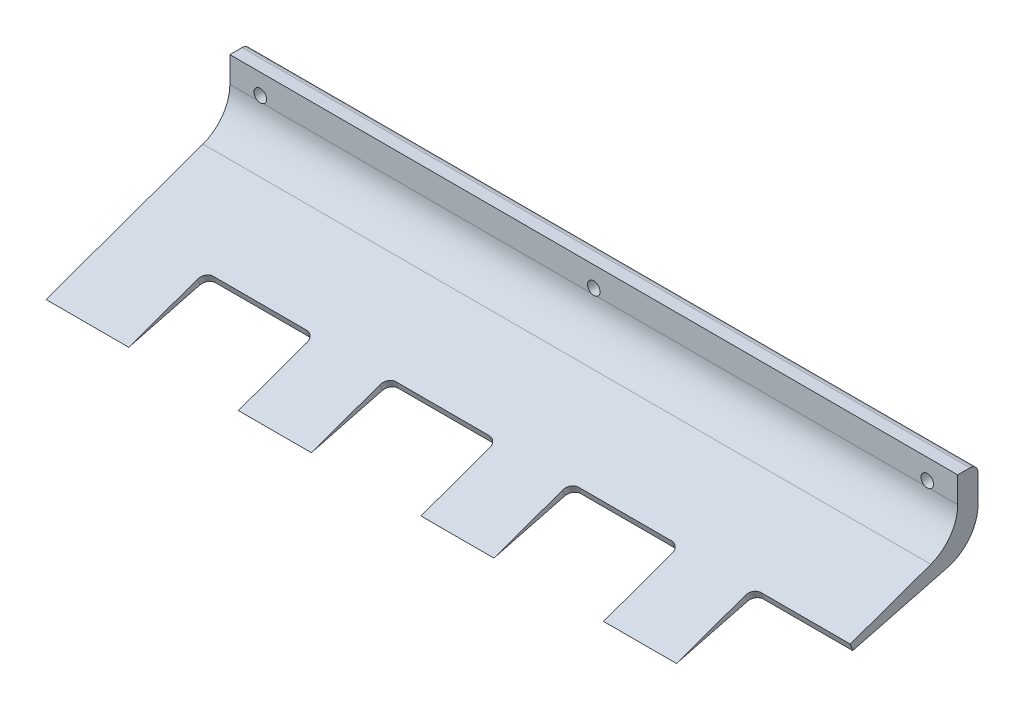
ISO-10303-21;
HEADER;
FILE_DESCRIPTION(('STEP AP214'),'2;1');
FILE_NAME('part.step','',(''),(''),'','','');
FILE_SCHEMA(('AUTOMOTIVE_DESIGN { 1 0 10303 214 1 1 1 1 }'));
ENDSEC;
DATA;
#1=APPLICATION_CONTEXT('core data for automotive mechanical design processes');
#2=APPLICATION_PROTOCOL_DEFINITION('international standard','automotive_design',2000,#1);
#3=PRODUCT_CONTEXT('',#1,'mechanical');
#4=PRODUCT('Part','Part','',(#3));
#5=PRODUCT_RELATED_PRODUCT_CATEGORY('part','',(#4));
#6=PRODUCT_DEFINITION_FORMATION('','',#4);
#7=PRODUCT_DEFINITION_CONTEXT('part definition',#1,'design');
#8=PRODUCT_DEFINITION('design','',#6,#7);
#9=PRODUCT_DEFINITION_SHAPE('','',#8);
#10=(LENGTH_UNIT() NAMED_UNIT(*) SI_UNIT(.MILLI.,.METRE.));
#11=(NAMED_UNIT(*) PLANE_ANGLE_UNIT() SI_UNIT($,.RADIAN.));
#12=(NAMED_UNIT(*) SI_UNIT($,.STERADIAN.) SOLID_ANGLE_UNIT());
#13=UNCERTAINTY_MEASURE_WITH_UNIT(LENGTH_MEASURE(1.E-05),#10,'distance_accuracy_value','');
#14=(GEOMETRIC_REPRESENTATION_CONTEXT(3) GLOBAL_UNCERTAINTY_ASSIGNED_CONTEXT((#13)) GLOBAL_UNIT_ASSIGNED_CONTEXT((#10,
#11,#12)) REPRESENTATION_CONTEXT('',''));
#15=CARTESIAN_POINT('',(0.,0.,0.));
#16=DIRECTION('',(0.,0.,1.));
#17=DIRECTION('',(1.,0.,0.));
#18=AXIS2_PLACEMENT_3D('',#15,#16,#17);
#19=CARTESIAN_POINT('',(179.4,12.0799686122915,4.32153801259702));
#20=DIRECTION('',(0.,-0.941562454937275,-0.336838453049071));
#21=DIRECTION('',(0.,0.336838453049071,-0.941562454937275));
#22=AXIS2_PLACEMENT_3D('',#19,#20,#21);
#23=PLANE('',#22);
#24=DIRECTION('',(-1.,0.,0.));
#25=VECTOR('',#24,1.);
#26=CARTESIAN_POINT('',(179.4,-3.47964772152142,47.8152377981518));
#27=LINE('',#26,#25);
#28=CARTESIAN_POINT('',(155.4,-3.47964772152142,47.8152377981518));
#29=VERTEX_POINT('',#28);
#30=CARTESIAN_POINT('',(137.4,-3.47964772152141,47.8152377981518));
#31=VERTEX_POINT('',#30);
#32=EDGE_CURVE('E253',#29,#31,#27,.T.);
#33=ORIENTED_EDGE('',*,*,#32,.F.);
#34=DIRECTION('',(0.,-0.336838453049071,0.941562454937275));
#35=VECTOR('',#34,1.);
#36=CARTESIAN_POINT('',(155.4,-3.47964772152141,47.8152377981518));
#37=LINE('',#36,#35);
#38=CARTESIAN_POINT('',(155.4,2.58344443336187,30.8671136092809));
#39=VERTEX_POINT('',#38);
#40=EDGE_CURVE('E237',#39,#29,#37,.T.);
#41=ORIENTED_EDGE('',*,*,#40,.F.);
#42=CARTESIAN_POINT('',(157.4,2.58344443336187,30.8671136092809));
#43=DIRECTION('',(0.,-0.941562454937275,-0.336838453049071));
#44=DIRECTION('',(0.,0.336838453049071,-0.941562454937275));
#45=AXIS2_PLACEMENT_3D('',#42,#43,#44);
#46=CIRCLE('',#45,2.);
#47=CARTESIAN_POINT('',(157.4,3.25712133946002,28.9839886994063));
#48=VERTEX_POINT('',#47);
#49=EDGE_CURVE('E906',#39,#48,#46,.T.);
#50=ORIENTED_EDGE('',*,*,#49,.T.);
#51=DIRECTION('',(-1.,0.,0.));
#52=VECTOR('',#51,1.);
#53=CARTESIAN_POINT('',(182.4,3.25712133946002,28.9839886994063));
#54=LINE('',#53,#52);
#55=CARTESIAN_POINT('',(179.4,3.25712133946002,28.9839886994063));
#56=VERTEX_POINT('',#55);
#57=EDGE_CURVE('E247',#56,#48,#54,.T.);
#58=ORIENTED_EDGE('',*,*,#57,.F.);
#59=DIRECTION('',(0.,-0.336838453049071,0.941562454937275));
#60=VECTOR('',#59,1.);
#61=CARTESIAN_POINT('',(179.4,12.0799686122915,4.32153801259702));
#62=LINE('',#61,#60);
#63=CARTESIAN_POINT('',(179.4,10.3591915771234,9.13161546950928));
#64=VERTEX_POINT('',#63);
#65=EDGE_CURVE('E296',#64,#56,#62,.T.);
#66=ORIENTED_EDGE('',*,*,#65,.F.);
#67=DIRECTION('',(-1.,0.,0.));
#68=VECTOR('',#67,1.);
#69=CARTESIAN_POINT('',(0.,10.3591915771234,9.13161546950928));
#70=LINE('',#69,#68);
#71=CARTESIAN_POINT('',(0.,10.3591915771234,9.13161546950928));
#72=VERTEX_POINT('',#71);
#73=EDGE_CURVE('E437',#64,#72,#70,.T.);
#74=ORIENTED_EDGE('',*,*,#73,.T.);
#75=DIRECTION('',(0.,-0.336838453049071,0.941562454937275));
#76=VECTOR('',#75,1.);
#77=CARTESIAN_POINT('',(0.,12.0799686122915,4.32153801259702));
#78=LINE('',#77,#76);
#79=CARTESIAN_POINT('',(0.,-3.47964772152142,47.8152377981518));
#80=VERTEX_POINT('',#79);
#81=EDGE_CURVE('E307',#72,#80,#78,.T.);
#82=ORIENTED_EDGE('',*,*,#81,.T.);
#83=CARTESIAN_POINT('',(20.4000000000002,-3.47964772152142,47.8152377981518));
#84=VERTEX_POINT('',#83);
#85=EDGE_CURVE('E266',#84,#80,#27,.T.);
#86=ORIENTED_EDGE('',*,*,#85,.F.);
#87=DIRECTION('',(0.,-0.336838453049071,0.941562454937275));
#88=VECTOR('',#87,1.);
#89=CARTESIAN_POINT('',(20.4000000000001,-3.47964772152141,47.8152377981518));
#90=LINE('',#89,#88);
#91=CARTESIAN_POINT('',(20.4000000000001,2.58344443336187,30.8671136092809));
#92=VERTEX_POINT('',#91);
#93=EDGE_CURVE('E364',#92,#84,#90,.T.);
#94=ORIENTED_EDGE('',*,*,#93,.F.);
#95=CARTESIAN_POINT('',(22.4000000000001,2.58344443336187,30.8671136092809));
#96=DIRECTION('',(0.,-0.941562454937275,-0.336838453049071));
#97=DIRECTION('',(0.,0.336838453049071,-0.941562454937275));
#98=AXIS2_PLACEMENT_3D('',#95,#96,#97);
#99=CIRCLE('',#98,2.);
#100=CARTESIAN_POINT('',(22.4000000000001,3.25712133946002,28.9839886994063));
#101=VERTEX_POINT('',#100);
#102=EDGE_CURVE('E53',#92,#101,#99,.T.);
#103=ORIENTED_EDGE('',*,*,#102,.T.);
#104=DIRECTION('',(-1.,0.,0.));
#105=VECTOR('',#104,1.);
#106=CARTESIAN_POINT('',(47.4000000000001,3.25712133946002,28.9839886994063));
#107=LINE('',#106,#105);
#108=CARTESIAN_POINT('',(45.4000000000001,3.25712133946002,28.9839886994063));
#109=VERTEX_POINT('',#108);
#110=EDGE_CURVE('E360',#109,#101,#107,.T.);
#111=ORIENTED_EDGE('',*,*,#110,.F.);
#112=CARTESIAN_POINT('',(45.4000000000001,2.58344443336187,30.8671136092809));
#113=DIRECTION('',(0.,-0.941562454937275,-0.336838453049071));
#114=DIRECTION('',(0.,0.336838453049071,-0.941562454937275));
#115=AXIS2_PLACEMENT_3D('',#112,#113,#114);
#116=CIRCLE('',#115,2.);
#117=CARTESIAN_POINT('',(47.4000000000001,2.58344443336188,30.8671136092809));
#118=VERTEX_POINT('',#117);
#119=EDGE_CURVE('E929',#109,#118,#116,.T.);
#120=ORIENTED_EDGE('',*,*,#119,.T.);
#121=DIRECTION('',(0.,0.336838453049071,-0.941562454937275));
#122=VECTOR('',#121,1.);
#123=CARTESIAN_POINT('',(47.4000000000001,-3.47964772152141,47.8152377981518));
#124=LINE('',#123,#122);
#125=CARTESIAN_POINT('',(47.4000000000001,-3.47964772152141,47.8152377981518));
#126=VERTEX_POINT('',#125);
#127=EDGE_CURVE('E356',#126,#118,#124,.T.);
#128=ORIENTED_EDGE('',*,*,#127,.F.);
#129=CARTESIAN_POINT('',(65.4000000000001,-3.47964772152142,47.8152377981518));
#130=VERTEX_POINT('',#129);
#131=EDGE_CURVE('E273',#130,#126,#27,.T.);
#132=ORIENTED_EDGE('',*,*,#131,.F.);
#133=DIRECTION('',(0.,-0.336838453049071,0.941562454937275));
#134=VECTOR('',#133,1.);
#135=CARTESIAN_POINT('',(65.4000000000001,-3.47964772152141,47.8152377981518));
#136=LINE('',#135,#134);
#137=CARTESIAN_POINT('',(65.4000000000001,2.58344443336187,30.8671136092809));
#138=VERTEX_POINT('',#137);
#139=EDGE_CURVE('E348',#138,#130,#136,.T.);
#140=ORIENTED_EDGE('',*,*,#139,.F.);
#141=CARTESIAN_POINT('',(67.4000000000001,2.58344443336187,30.8671136092809));
#142=DIRECTION('',(0.,-0.941562454937275,-0.336838453049071));
#143=DIRECTION('',(0.,0.336838453049071,-0.941562454937275));
#144=AXIS2_PLACEMENT_3D('',#141,#142,#143);
#145=CIRCLE('',#144,2.);
#146=CARTESIAN_POINT('',(67.4000000000001,3.25712133946002,28.9839886994063));
#147=VERTEX_POINT('',#146);
#148=EDGE_CURVE('E923',#138,#147,#145,.T.);
#149=ORIENTED_EDGE('',*,*,#148,.T.);
#150=DIRECTION('',(-1.,0.,0.));
#151=VECTOR('',#150,1.);
#152=CARTESIAN_POINT('',(92.4000000000001,3.25712133946002,28.9839886994063));
#153=LINE('',#152,#151);
#154=CARTESIAN_POINT('',(90.4000000000001,3.25712133946002,28.9839886994063));
#155=VERTEX_POINT('',#154);
#156=EDGE_CURVE('E383',#155,#147,#153,.T.);
#157=ORIENTED_EDGE('',*,*,#156,.F.);
#158=CARTESIAN_POINT('',(90.4000000000001,2.58344443336187,30.8671136092809));
#159=DIRECTION('',(0.,-0.941562454937275,-0.336838453049071));
#160=DIRECTION('',(0.,0.336838453049071,-0.941562454937275));
#161=AXIS2_PLACEMENT_3D('',#158,#159,#160);
#162=CIRCLE('',#161,2.);
#163=CARTESIAN_POINT('',(92.4000000000001,2.58344443336188,30.8671136092809));
#164=VERTEX_POINT('',#163);
#165=EDGE_CURVE('E917',#155,#164,#162,.T.);
#166=ORIENTED_EDGE('',*,*,#165,.T.);
#167=DIRECTION('',(0.,0.336838453049071,-0.941562454937275));
#168=VECTOR('',#167,1.);
#169=CARTESIAN_POINT('',(92.4000000000001,-3.47964772152141,47.8152377981518));
#170=LINE('',#169,#168);
#171=CARTESIAN_POINT('',(92.4000000000001,-3.47964772152141,47.8152377981518));
#172=VERTEX_POINT('',#171);
#173=EDGE_CURVE('E379',#172,#164,#170,.T.);
#174=ORIENTED_EDGE('',*,*,#173,.F.);
#175=CARTESIAN_POINT('',(110.4,-3.47964772152142,47.8152377981518));
#176=VERTEX_POINT('',#175);
#177=EDGE_CURVE('E264',#176,#172,#27,.T.);
#178=ORIENTED_EDGE('',*,*,#177,.F.);
#179=DIRECTION('',(0.,-0.336838453049071,0.941562454937275));
#180=VECTOR('',#179,1.);
#181=CARTESIAN_POINT('',(110.4,-3.47964772152141,47.8152377981518));
#182=LINE('',#181,#180);
#183=CARTESIAN_POINT('',(110.4,2.58344443336187,30.8671136092809));
#184=VERTEX_POINT('',#183);
#185=EDGE_CURVE('E370',#184,#176,#182,.T.);
#186=ORIENTED_EDGE('',*,*,#185,.F.);
#187=CARTESIAN_POINT('',(112.4,2.58344443336187,30.8671136092809));
#188=DIRECTION('',(0.,-0.941562454937275,-0.336838453049071));
#189=DIRECTION('',(0.,0.336838453049071,-0.941562454937275));
#190=AXIS2_PLACEMENT_3D('',#187,#188,#189);
#191=CIRCLE('',#190,2.);
#192=CARTESIAN_POINT('',(112.4,3.25712133946002,28.9839886994063));
#193=VERTEX_POINT('',#192);
#194=EDGE_CURVE('E893',#184,#193,#191,.T.);
#195=ORIENTED_EDGE('',*,*,#194,.T.);
#196=DIRECTION('',(-1.,0.,0.));
#197=VECTOR('',#196,1.);
#198=CARTESIAN_POINT('',(137.4,3.25712133946002,28.9839886994063));
#199=LINE('',#198,#197);
#200=CARTESIAN_POINT('',(135.4,3.25712133946002,28.9839886994063));
#201=VERTEX_POINT('',#200);
#202=EDGE_CURVE('E403',#201,#193,#199,.T.);
#203=ORIENTED_EDGE('',*,*,#202,.F.);
#204=CARTESIAN_POINT('',(135.4,2.58344443336187,30.8671136092809));
#205=DIRECTION('',(0.,-0.941562454937275,-0.336838453049071));
#206=DIRECTION('',(0.,0.336838453049071,-0.941562454937275));
#207=AXIS2_PLACEMENT_3D('',#204,#205,#206);
#208=CIRCLE('',#207,2.);
#209=CARTESIAN_POINT('',(137.4,2.58344443336188,30.8671136092809));
#210=VERTEX_POINT('',#209);
#211=EDGE_CURVE('E911',#201,#210,#208,.T.);
#212=ORIENTED_EDGE('',*,*,#211,.T.);
#213=DIRECTION('',(0.,0.336838453049071,-0.941562454937275));
#214=VECTOR('',#213,1.);
#215=CARTESIAN_POINT('',(137.4,-3.47964772152141,47.8152377981518));
#216=LINE('',#215,#214);
#217=EDGE_CURVE('E261',#31,#210,#216,.T.);
#218=ORIENTED_EDGE('',*,*,#217,.F.);
#219=EDGE_LOOP('',(#33,#41,#50,#58,#66,#74,#82,#86,#94,#103,#111,#120,#128,#132,#140,#149,#157,
#166,#174,#178,#186,#195,#203,#212,#218));
#220=FACE_BOUND('',#219,.T.);
#221=ADVANCED_FACE('F44',(#220),#23,.F.);
#222=CARTESIAN_POINT('',(179.4,8.34007858571382,2.1591294076312));
#223=DIRECTION('',(0.,0.968084626068342,0.250623535946084));
#224=DIRECTION('',(0.,-0.250623535946084,0.968084626068342));
#225=AXIS2_PLACEMENT_3D('',#222,#223,#224);
#226=PLANE('',#225);
#227=DIRECTION('',(1.,0.,0.));
#228=VECTOR('',#227,1.);
#229=CARTESIAN_POINT('',(182.4,1.55329812203007,28.3744559235201));
#230=LINE('',#229,#228);
#231=CARTESIAN_POINT('',(157.4,1.55329812203007,28.3744559235201));
#232=VERTEX_POINT('',#231);
#233=CARTESIAN_POINT('',(179.4,1.55329812203007,28.3744559235201));
#234=VERTEX_POINT('',#233);
#235=EDGE_CURVE('E257',#232,#234,#230,.T.);
#236=ORIENTED_EDGE('',*,*,#235,.F.);
#237=CARTESIAN_POINT('',(157.4,1.05000353767492,30.3185341109832));
#238=DIRECTION('',(0.,0.968084626068342,0.250623535946084));
#239=DIRECTION('',(0.,0.250623535946084,-0.968084626068342));
#240=AXIS2_PLACEMENT_3D('',#237,#238,#239);
#241=ELLIPSE('',#240,2.00816967351151,2.);
#242=CARTESIAN_POINT('',(155.4,1.05000353767492,30.3185341109832));
#243=VERTEX_POINT('',#242);
#244=EDGE_CURVE('E255',#232,#243,#241,.T.);
#245=ORIENTED_EDGE('',*,*,#244,.T.);
#246=DIRECTION('',(0.,0.250623535946084,-0.968084626068342));
#247=VECTOR('',#246,1.);
#248=CARTESIAN_POINT('',(155.4,-3.09686634528519,46.3366665056325));
#249=LINE('',#248,#247);
#250=EDGE_CURVE('E240',#29,#243,#249,.T.);
#251=ORIENTED_EDGE('',*,*,#250,.F.);
#252=ORIENTED_EDGE('',*,*,#32,.T.);
#253=DIRECTION('',(0.,-0.250623535946084,0.968084626068342));
#254=VECTOR('',#253,1.);
#255=CARTESIAN_POINT('',(137.4,-3.09686634528519,46.3366665056325));
#256=LINE('',#255,#254);
#257=CARTESIAN_POINT('',(137.4,1.05000353767492,30.3185341109832));
#258=VERTEX_POINT('',#257);
#259=EDGE_CURVE('E389',#258,#31,#256,.T.);
#260=ORIENTED_EDGE('',*,*,#259,.F.);
#261=CARTESIAN_POINT('',(135.4,1.05000353767492,30.3185341109832));
#262=DIRECTION('',(0.,0.968084626068342,0.250623535946084));
#263=DIRECTION('',(0.,0.250623535946084,-0.968084626068342));
#264=AXIS2_PLACEMENT_3D('',#261,#262,#263);
#265=ELLIPSE('',#264,2.00816967351151,2.);
#266=CARTESIAN_POINT('',(135.4,1.55329812203007,28.3744559235201));
#267=VERTEX_POINT('',#266);
#268=EDGE_CURVE('E914',#258,#267,#265,.T.);
#269=ORIENTED_EDGE('',*,*,#268,.T.);
#270=DIRECTION('',(1.,0.,0.));
#271=VECTOR('',#270,1.);
#272=CARTESIAN_POINT('',(137.4,1.55329812203007,28.3744559235201));
#273=LINE('',#272,#271);
#274=CARTESIAN_POINT('',(112.4,1.55329812203007,28.3744559235201));
#275=VERTEX_POINT('',#274);
#276=EDGE_CURVE('E393',#275,#267,#273,.T.);
#277=ORIENTED_EDGE('',*,*,#276,.F.);
#278=CARTESIAN_POINT('',(112.4,1.05000353767492,30.3185341109832));
#279=DIRECTION('',(0.,0.968084626068342,0.250623535946084));
#280=DIRECTION('',(0.,0.250623535946084,-0.968084626068342));
#281=AXIS2_PLACEMENT_3D('',#278,#279,#280);
#282=ELLIPSE('',#281,2.00816967351151,2.);
#283=CARTESIAN_POINT('',(110.4,1.05000353767492,30.3185341109832));
#284=VERTEX_POINT('',#283);
#285=EDGE_CURVE('E898',#275,#284,#282,.T.);
#286=ORIENTED_EDGE('',*,*,#285,.T.);
#287=DIRECTION('',(0.,0.250623535946084,-0.968084626068342));
#288=VECTOR('',#287,1.);
#289=CARTESIAN_POINT('',(110.4,-3.09686634528519,46.3366665056325));
#290=LINE('',#289,#288);
#291=EDGE_CURVE('E397',#176,#284,#290,.T.);
#292=ORIENTED_EDGE('',*,*,#291,.F.);
#293=ORIENTED_EDGE('',*,*,#177,.T.);
#294=DIRECTION('',(0.,-0.250623535946084,0.968084626068342));
#295=VECTOR('',#294,1.);
#296=CARTESIAN_POINT('',(92.4000000000001,-3.09686634528519,46.3366665056325));
#297=LINE('',#296,#295);
#298=CARTESIAN_POINT('',(92.4000000000001,1.05000353767492,30.3185341109832));
#299=VERTEX_POINT('',#298);
#300=EDGE_CURVE('E367',#299,#172,#297,.T.);
#301=ORIENTED_EDGE('',*,*,#300,.F.);
#302=CARTESIAN_POINT('',(90.4000000000001,1.05000353767492,30.3185341109832));
#303=DIRECTION('',(0.,0.968084626068342,0.250623535946084));
#304=DIRECTION('',(0.,0.250623535946084,-0.968084626068342));
#305=AXIS2_PLACEMENT_3D('',#302,#303,#304);
#306=ELLIPSE('',#305,2.00816967351151,2.);
#307=CARTESIAN_POINT('',(90.4000000000001,1.55329812203007,28.3744559235201));
#308=VERTEX_POINT('',#307);
#309=EDGE_CURVE('E920',#299,#308,#306,.T.);
#310=ORIENTED_EDGE('',*,*,#309,.T.);
#311=DIRECTION('',(1.,0.,0.));
#312=VECTOR('',#311,1.);
#313=CARTESIAN_POINT('',(92.4000000000001,1.55329812203007,28.3744559235201));
#314=LINE('',#313,#312);
#315=CARTESIAN_POINT('',(67.4000000000001,1.55329812203007,28.3744559235201));
#316=VERTEX_POINT('',#315);
#317=EDGE_CURVE('E371',#316,#308,#314,.T.);
#318=ORIENTED_EDGE('',*,*,#317,.F.);
#319=CARTESIAN_POINT('',(67.4000000000001,1.05000353767492,30.3185341109832));
#320=DIRECTION('',(0.,0.968084626068342,0.250623535946084));
#321=DIRECTION('',(0.,0.250623535946084,-0.968084626068342));
#322=AXIS2_PLACEMENT_3D('',#319,#320,#321);
#323=ELLIPSE('',#322,2.00816967351151,2.);
#324=CARTESIAN_POINT('',(65.4000000000001,1.05000353767492,30.3185341109832));
#325=VERTEX_POINT('',#324);
#326=EDGE_CURVE('E926',#316,#325,#323,.T.);
#327=ORIENTED_EDGE('',*,*,#326,.T.);
#328=DIRECTION('',(0.,0.250623535946084,-0.968084626068342));
#329=VECTOR('',#328,1.);
#330=CARTESIAN_POINT('',(65.4000000000001,-3.09686634528519,46.3366665056325));
#331=LINE('',#330,#329);
#332=EDGE_CURVE('E375',#130,#325,#331,.T.);
#333=ORIENTED_EDGE('',*,*,#332,.F.);
#334=ORIENTED_EDGE('',*,*,#131,.T.);
#335=DIRECTION('',(0.,-0.250623535946084,0.968084626068342));
#336=VECTOR('',#335,1.);
#337=CARTESIAN_POINT('',(47.4000000000001,-3.09686634528519,46.3366665056325));
#338=LINE('',#337,#336);
#339=CARTESIAN_POINT('',(47.4000000000001,1.05000353767492,30.3185341109832));
#340=VERTEX_POINT('',#339);
#341=EDGE_CURVE('E345',#340,#126,#338,.T.);
#342=ORIENTED_EDGE('',*,*,#341,.F.);
#343=CARTESIAN_POINT('',(45.4000000000001,1.05000353767492,30.3185341109832));
#344=DIRECTION('',(0.,0.968084626068342,0.250623535946084));
#345=DIRECTION('',(0.,0.250623535946084,-0.968084626068342));
#346=AXIS2_PLACEMENT_3D('',#343,#344,#345);
#347=ELLIPSE('',#346,2.00816967351151,2.);
#348=CARTESIAN_POINT('',(45.4000000000001,1.55329812203007,28.3744559235201));
#349=VERTEX_POINT('',#348);
#350=EDGE_CURVE('E932',#340,#349,#347,.T.);
#351=ORIENTED_EDGE('',*,*,#350,.T.);
#352=DIRECTION('',(1.,0.,0.));
#353=VECTOR('',#352,1.);
#354=CARTESIAN_POINT('',(47.4000000000001,1.55329812203007,28.3744559235201));
#355=LINE('',#354,#353);
#356=CARTESIAN_POINT('',(22.4000000000001,1.55329812203007,28.3744559235201));
#357=VERTEX_POINT('',#356);
#358=EDGE_CURVE('E349',#357,#349,#355,.T.);
#359=ORIENTED_EDGE('',*,*,#358,.F.);
#360=CARTESIAN_POINT('',(22.4000000000001,1.05000353767492,30.3185341109832));
#361=DIRECTION('',(0.,0.968084626068342,0.250623535946084));
#362=DIRECTION('',(0.,0.250623535946084,-0.968084626068342));
#363=AXIS2_PLACEMENT_3D('',#360,#361,#362);
#364=ELLIPSE('',#363,2.00816967351151,2.);
#365=CARTESIAN_POINT('',(20.4000000000001,1.05000353767492,30.3185341109832));
#366=VERTEX_POINT('',#365);
#367=EDGE_CURVE('E11',#357,#366,#364,.T.);
#368=ORIENTED_EDGE('',*,*,#367,.T.);
#369=DIRECTION('',(0.,0.250623535946084,-0.968084626068342));
#370=VECTOR('',#369,1.);
#371=CARTESIAN_POINT('',(20.4000000000001,-3.09686634528519,46.3366665056325));
#372=LINE('',#371,#370);
#373=EDGE_CURVE('E353',#84,#366,#372,.T.);
#374=ORIENTED_EDGE('',*,*,#373,.F.);
#375=ORIENTED_EDGE('',*,*,#85,.T.);
#376=DIRECTION('',(0.,0.250623535946084,-0.968084626068342));
#377=VECTOR('',#376,1.);
#378=CARTESIAN_POINT('',(0.,8.34007858571382,2.1591294076312));
#379=LINE('',#378,#377);
#380=CARTESIAN_POINT('',(0.,7.60623126900352,4.99376464053915));
#381=VERTEX_POINT('',#380);
#382=EDGE_CURVE('E304',#80,#381,#379,.T.);
#383=ORIENTED_EDGE('',*,*,#382,.T.);
#384=DIRECTION('',(-1.,0.,0.));
#385=VECTOR('',#384,1.);
#386=CARTESIAN_POINT('',(179.4,7.60623126900352,4.99376464053915));
#387=LINE('',#386,#385);
#388=CARTESIAN_POINT('',(179.4,7.60623126900352,4.99376464053915));
#389=VERTEX_POINT('',#388);
#390=EDGE_CURVE('E425',#381,#389,#387,.F.);
#391=ORIENTED_EDGE('',*,*,#390,.T.);
#392=DIRECTION('',(0.,0.250623535946084,-0.968084626068342));
#393=VECTOR('',#392,1.);
#394=CARTESIAN_POINT('',(179.4,8.34007858571382,2.1591294076312));
#395=LINE('',#394,#393);
#396=EDGE_CURVE('E317',#234,#389,#395,.T.);
#397=ORIENTED_EDGE('',*,*,#396,.F.);
#398=EDGE_LOOP('',(#236,#245,#251,#252,#260,#269,#277,#286,#292,#293,#301,#310,#318,#327,#333,
#334,#342,#351,#359,#368,#374,#375,#383,#391,#397));
#399=FACE_BOUND('',#398,.T.);
#400=ADVANCED_FACE('F251',(#399),#226,.F.);
#401=CARTESIAN_POINT('',(179.4,0.,-2.50000000000001));
#402=DIRECTION('',(0.,0.,-1.));
#403=DIRECTION('',(0.,1.,0.));
#404=AXIS2_PLACEMENT_3D('',#401,#402,#403);
#405=PLANE('',#404);
#406=CARTESIAN_POINT('',(7.50000000000001,21.1389375146153,-2.5));
#407=DIRECTION('',(0.,0.,-1.));
#408=DIRECTION('',(0.,1.,0.));
#409=AXIS2_PLACEMENT_3D('',#406,#407,#408);
#410=CIRCLE('',#409,1.55);
#411=CARTESIAN_POINT('',(7.50000000000001,22.6889375146153,-2.5));
#412=VERTEX_POINT('',#411);
#413=EDGE_CURVE('E309',#412,#412,#410,.T.);
#414=ORIENTED_EDGE('',*,*,#413,.F.);
#415=EDGE_LOOP('',(#414));
#416=FACE_BOUND('',#415,.T.);
#417=CARTESIAN_POINT('',(171.9,21.1389375146153,-2.5));
#418=DIRECTION('',(0.,0.,-1.));
#419=DIRECTION('',(0.,1.,0.));
#420=AXIS2_PLACEMENT_3D('',#417,#418,#419);
#421=CIRCLE('',#420,1.54999999999999);
#422=CARTESIAN_POINT('',(171.9,22.6889375146153,-2.5));
#423=VERTEX_POINT('',#422);
#424=EDGE_CURVE('E330',#423,#423,#421,.T.);
#425=ORIENTED_EDGE('',*,*,#424,.F.);
#426=EDGE_LOOP('',(#425));
#427=FACE_BOUND('',#426,.T.);
#428=CARTESIAN_POINT('',(89.7,21.1389375146153,-2.5));
#429=DIRECTION('',(0.,0.,-1.));
#430=DIRECTION('',(0.,1.,0.));
#431=AXIS2_PLACEMENT_3D('',#428,#429,#430);
#432=CIRCLE('',#431,1.54999999999999);
#433=CARTESIAN_POINT('',(89.7,22.6889375146153,-2.5));
#434=VERTEX_POINT('',#433);
#435=EDGE_CURVE('E338',#434,#434,#432,.T.);
#436=ORIENTED_EDGE('',*,*,#435,.F.);
#437=EDGE_LOOP('',(#436));
#438=FACE_BOUND('',#437,.T.);
#439=DIRECTION('',(0.,-1.,0.));
#440=VECTOR('',#439,1.);
#441=CARTESIAN_POINT('',(0.,0.,-2.50000000000001));
#442=LINE('',#441,#440);
#443=CARTESIAN_POINT('',(0.,24.1389375146153,-2.5));
#444=VERTEX_POINT('',#443);
#445=CARTESIAN_POINT('',(0.,17.2870775296869,-2.5));
#446=VERTEX_POINT('',#445);
#447=EDGE_CURVE('E301',#444,#446,#442,.T.);
#448=ORIENTED_EDGE('',*,*,#447,.F.);
#449=DIRECTION('',(-1.,0.,0.));
#450=VECTOR('',#449,1.);
#451=CARTESIAN_POINT('',(179.4,24.1389375146153,-2.5));
#452=LINE('',#451,#450);
#453=CARTESIAN_POINT('',(179.4,24.1389375146153,-2.5));
#454=VERTEX_POINT('',#453);
#455=EDGE_CURVE('E463',#444,#454,#452,.F.);
#456=ORIENTED_EDGE('',*,*,#455,.T.);
#457=DIRECTION('',(0.,-1.,0.));
#458=VECTOR('',#457,1.);
#459=CARTESIAN_POINT('',(179.4,0.,-2.50000000000001));
#460=LINE('',#459,#458);
#461=CARTESIAN_POINT('',(179.4,17.2870775296869,-2.5));
#462=VERTEX_POINT('',#461);
#463=EDGE_CURVE('E314',#454,#462,#460,.T.);
#464=ORIENTED_EDGE('',*,*,#463,.T.);
#465=DIRECTION('',(-1.,0.,0.));
#466=VECTOR('',#465,1.);
#467=CARTESIAN_POINT('',(0.,17.2870775296869,-2.5));
#468=LINE('',#467,#466);
#469=EDGE_CURVE('E263',#462,#446,#468,.T.);
#470=ORIENTED_EDGE('',*,*,#469,.T.);
#471=EDGE_LOOP('',(#448,#456,#464,#470));
#472=FACE_BOUND('',#471,.T.);
#473=ADVANCED_FACE('F511',(#416,#427,#438,#472),#405,.T.);
#474=CARTESIAN_POINT('',(179.4,26.1389375146153,0.));
#475=DIRECTION('',(0.,1.,0.));
#476=DIRECTION('',(0.,0.,1.));
#477=AXIS2_PLACEMENT_3D('',#474,#475,#476);
#478=PLANE('',#477);
#479=DIRECTION('',(0.,0.,-1.));
#480=VECTOR('',#479,1.);
#481=CARTESIAN_POINT('',(179.4,26.1389375146153,0.));
#482=LINE('',#481,#480);
#483=CARTESIAN_POINT('',(179.4,26.1389375146153,2.5));
#484=VERTEX_POINT('',#483);
#485=CARTESIAN_POINT('',(179.4,26.1389375146153,-0.5));
#486=VERTEX_POINT('',#485);
#487=EDGE_CURVE('E290',#484,#486,#482,.T.);
#488=ORIENTED_EDGE('',*,*,#487,.T.);
#489=DIRECTION('',(-1.,0.,0.));
#490=VECTOR('',#489,1.);
#491=CARTESIAN_POINT('',(179.4,26.1389375146153,-0.5));
#492=LINE('',#491,#490);
#493=CARTESIAN_POINT('',(0.,26.1389375146153,-0.5));
#494=VERTEX_POINT('',#493);
#495=EDGE_CURVE('E456',#486,#494,#492,.T.);
#496=ORIENTED_EDGE('',*,*,#495,.T.);
#497=DIRECTION('',(0.,0.,-1.));
#498=VECTOR('',#497,1.);
#499=CARTESIAN_POINT('',(0.,26.1389375146153,0.));
#500=LINE('',#499,#498);
#501=CARTESIAN_POINT('',(0.,26.1389375146153,2.5));
#502=VERTEX_POINT('',#501);
#503=EDGE_CURVE('E297',#502,#494,#500,.T.);
#504=ORIENTED_EDGE('',*,*,#503,.F.);
#505=DIRECTION('',(-1.,0.,0.));
#506=VECTOR('',#505,1.);
#507=CARTESIAN_POINT('',(179.4,26.1389375146153,2.5));
#508=LINE('',#507,#506);
#509=EDGE_CURVE('E276',#484,#502,#508,.T.);
#510=ORIENTED_EDGE('',*,*,#509,.F.);
#511=EDGE_LOOP('',(#488,#496,#504,#510));
#512=FACE_BOUND('',#511,.T.);
#513=ADVANCED_FACE('F508',(#512),#478,.T.);
#514=CARTESIAN_POINT('',(179.4,0.,2.5));
#515=DIRECTION('',(0.,0.,-1.));
#516=DIRECTION('',(0.,1.,0.));
#517=AXIS2_PLACEMENT_3D('',#514,#515,#516);
#518=PLANE('',#517);
#519=DIRECTION('',(-1.,0.,0.));
#520=VECTOR('',#519,1.);
#521=CARTESIAN_POINT('',(179.4,19.7748161264962,2.5));
#522=LINE('',#521,#520);
#523=CARTESIAN_POINT('',(0.,19.7748161264962,2.5));
#524=VERTEX_POINT('',#523);
#525=CARTESIAN_POINT('',(6.7640157348992,19.7748161264962,2.5));
#526=VERTEX_POINT('',#525);
#527=EDGE_CURVE('E445',#524,#526,#522,.F.);
#528=ORIENTED_EDGE('',*,*,#527,.T.);
#529=CARTESIAN_POINT('',(7.50000000000001,21.1389375146153,2.5));
#530=DIRECTION('',(0.,0.,-1.));
#531=DIRECTION('',(0.,1.,0.));
#532=AXIS2_PLACEMENT_3D('',#529,#530,#531);
#533=CIRCLE('',#532,1.55);
#534=CARTESIAN_POINT('',(8.23598426510081,19.7748161264962,2.5));
#535=VERTEX_POINT('',#534);
#536=EDGE_CURVE('E326',#526,#535,#533,.T.);
#537=ORIENTED_EDGE('',*,*,#536,.T.);
#538=CARTESIAN_POINT('',(88.9640157348992,19.7748161264962,2.5));
#539=VERTEX_POINT('',#538);
#540=EDGE_CURVE('E450',#535,#539,#522,.F.);
#541=ORIENTED_EDGE('',*,*,#540,.T.);
#542=CARTESIAN_POINT('',(89.7,21.1389375146153,2.5));
#543=DIRECTION('',(0.,0.,-1.));
#544=DIRECTION('',(0.,1.,0.));
#545=AXIS2_PLACEMENT_3D('',#542,#543,#544);
#546=CIRCLE('',#545,1.54999999999999);
#547=CARTESIAN_POINT('',(90.4359842651008,19.7748161264962,2.5));
#548=VERTEX_POINT('',#547);
#549=EDGE_CURVE('E246',#539,#548,#546,.T.);
#550=ORIENTED_EDGE('',*,*,#549,.T.);
#551=CARTESIAN_POINT('',(171.164015734899,19.7748161264962,2.5));
#552=VERTEX_POINT('',#551);
#553=EDGE_CURVE('E535',#548,#552,#522,.F.);
#554=ORIENTED_EDGE('',*,*,#553,.T.);
#555=CARTESIAN_POINT('',(171.9,21.1389375146153,2.5));
#556=DIRECTION('',(0.,0.,-1.));
#557=DIRECTION('',(0.,1.,0.));
#558=AXIS2_PLACEMENT_3D('',#555,#556,#557);
#559=CIRCLE('',#558,1.54999999999999);
#560=CARTESIAN_POINT('',(172.635984265101,19.7748161264962,2.5));
#561=VERTEX_POINT('',#560);
#562=EDGE_CURVE('E334',#552,#561,#559,.T.);
#563=ORIENTED_EDGE('',*,*,#562,.T.);
#564=CARTESIAN_POINT('',(179.4,19.7748161264962,2.5));
#565=VERTEX_POINT('',#564);
#566=EDGE_CURVE('E441',#561,#565,#522,.F.);
#567=ORIENTED_EDGE('',*,*,#566,.T.);
#568=DIRECTION('',(0.,-1.,0.));
#569=VECTOR('',#568,1.);
#570=CARTESIAN_POINT('',(179.4,0.,2.5));
#571=LINE('',#570,#569);
#572=EDGE_CURVE('E283',#484,#565,#571,.T.);
#573=ORIENTED_EDGE('',*,*,#572,.F.);
#574=ORIENTED_EDGE('',*,*,#509,.T.);
#575=DIRECTION('',(0.,-1.,0.));
#576=VECTOR('',#575,1.);
#577=CARTESIAN_POINT('',(0.,0.,2.5));
#578=LINE('',#577,#576);
#579=EDGE_CURVE('E293',#502,#524,#578,.T.);
#580=ORIENTED_EDGE('',*,*,#579,.T.);
#581=EDGE_LOOP('',(#528,#537,#541,#550,#554,#563,#567,#573,#574,#580));
#582=FACE_BOUND('',#581,.T.);
#583=ADVANCED_FACE('F502',(#582),#518,.F.);
#584=CARTESIAN_POINT('',(179.4,0.,0.));
#585=DIRECTION('',(1.,0.,0.));
#586=DIRECTION('',(0.,0.,-1.));
#587=AXIS2_PLACEMENT_3D('',#584,#585,#586);
#588=PLANE('',#587);
#589=DIRECTION('',(0.,-0.941562454937275,-0.336838453049071));
#590=VECTOR('',#589,1.);
#591=CARTESIAN_POINT('',(179.4,-12.7017834609277,23.2747839863976));
#592=LINE('',#591,#590);
#593=EDGE_CURVE('E392',#56,#234,#592,.T.);
#594=ORIENTED_EDGE('',*,*,#593,.T.);
#595=ORIENTED_EDGE('',*,*,#396,.T.);
#596=CARTESIAN_POINT('',(179.4,17.2870775296869,7.5));
#597=DIRECTION('',(1.,0.,0.));
#598=DIRECTION('',(0.,0.,-1.));
#599=AXIS2_PLACEMENT_3D('',#596,#597,#598);
#600=CIRCLE('',#599,10.);
#601=EDGE_CURVE('E431',#389,#462,#600,.T.);
#602=ORIENTED_EDGE('',*,*,#601,.T.);
#603=ORIENTED_EDGE('',*,*,#463,.F.);
#604=CARTESIAN_POINT('',(179.4,24.1389375146153,-0.5));
#605=DIRECTION('',(1.,0.,0.));
#606=DIRECTION('',(0.,0.,-1.));
#607=AXIS2_PLACEMENT_3D('',#604,#605,#606);
#608=CIRCLE('',#607,2.);
#609=EDGE_CURVE('E466',#454,#486,#608,.T.);
#610=ORIENTED_EDGE('',*,*,#609,.T.);
#611=ORIENTED_EDGE('',*,*,#487,.F.);
#612=ORIENTED_EDGE('',*,*,#572,.T.);
#613=CARTESIAN_POINT('',(179.4,19.7748161264962,12.5));
#614=DIRECTION('',(1.,0.,0.));
#615=DIRECTION('',(0.,0.,-1.));
#616=AXIS2_PLACEMENT_3D('',#613,#614,#615);
#617=CIRCLE('',#616,10.);
#618=EDGE_CURVE('E453',#565,#64,#617,.F.);
#619=ORIENTED_EDGE('',*,*,#618,.T.);
#620=ORIENTED_EDGE('',*,*,#65,.T.);
#621=EDGE_LOOP('',(#594,#595,#602,#603,#610,#611,#612,#619,#620));
#622=FACE_BOUND('',#621,.T.);
#623=ADVANCED_FACE('F418',(#622),#588,.T.);
#624=CARTESIAN_POINT('',(0.,0.,0.));
#625=DIRECTION('',(1.,0.,0.));
#626=DIRECTION('',(0.,0.,-1.));
#627=AXIS2_PLACEMENT_3D('',#624,#625,#626);
#628=PLANE('',#627);
#629=ORIENTED_EDGE('',*,*,#503,.T.);
#630=CARTESIAN_POINT('',(0.,24.1389375146153,-0.5));
#631=DIRECTION('',(1.,0.,0.));
#632=DIRECTION('',(0.,0.,-1.));
#633=AXIS2_PLACEMENT_3D('',#630,#631,#632);
#634=CIRCLE('',#633,2.);
#635=EDGE_CURVE('E460',#494,#444,#634,.F.);
#636=ORIENTED_EDGE('',*,*,#635,.T.);
#637=ORIENTED_EDGE('',*,*,#447,.T.);
#638=CARTESIAN_POINT('',(0.,17.2870775296869,7.5));
#639=DIRECTION('',(1.,0.,0.));
#640=DIRECTION('',(0.,0.,-1.));
#641=AXIS2_PLACEMENT_3D('',#638,#639,#640);
#642=CIRCLE('',#641,10.);
#643=EDGE_CURVE('E270',#446,#381,#642,.F.);
#644=ORIENTED_EDGE('',*,*,#643,.T.);
#645=ORIENTED_EDGE('',*,*,#382,.F.);
#646=ORIENTED_EDGE('',*,*,#81,.F.);
#647=CARTESIAN_POINT('',(0.,19.7748161264962,12.5));
#648=DIRECTION('',(1.,0.,0.));
#649=DIRECTION('',(0.,0.,-1.));
#650=AXIS2_PLACEMENT_3D('',#647,#648,#649);
#651=CIRCLE('',#650,10.);
#652=EDGE_CURVE('E449',#72,#524,#651,.T.);
#653=ORIENTED_EDGE('',*,*,#652,.T.);
#654=ORIENTED_EDGE('',*,*,#579,.F.);
#655=EDGE_LOOP('',(#629,#636,#637,#644,#645,#646,#653,#654));
#656=FACE_BOUND('',#655,.T.);
#657=ADVANCED_FACE('F501',(#656),#628,.F.);
#658=CARTESIAN_POINT('',(179.4,17.2870775296869,7.5));
#659=DIRECTION('',(1.,0.,0.));
#660=DIRECTION('',(0.,0.,-1.));
#661=AXIS2_PLACEMENT_3D('',#658,#659,#660);
#662=CYLINDRICAL_SURFACE('',#661,10.);
#663=ORIENTED_EDGE('',*,*,#601,.F.);
#664=ORIENTED_EDGE('',*,*,#390,.F.);
#665=ORIENTED_EDGE('',*,*,#643,.F.);
#666=ORIENTED_EDGE('',*,*,#469,.F.);
#667=EDGE_LOOP('',(#663,#664,#665,#666));
#668=FACE_BOUND('',#667,.T.);
#669=ADVANCED_FACE('F434',(#668),#662,.T.);
#670=CARTESIAN_POINT('',(179.4,19.7748161264962,12.5));
#671=DIRECTION('',(1.,0.,0.));
#672=DIRECTION('',(0.,0.,-1.));
#673=AXIS2_PLACEMENT_3D('',#670,#671,#672);
#674=CYLINDRICAL_SURFACE('',#673,10.);
#675=ORIENTED_EDGE('',*,*,#540,.F.);
#676=CARTESIAN_POINT('',(8.23598426510081,19.7748161264962,2.5));
#677=CARTESIAN_POINT('',(8.1975944130916,19.7541039397819,2.50000092723772));
#678=CARTESIAN_POINT('',(8.15834836664296,19.7350228397481,2.50006418878408));
#679=CARTESIAN_POINT('',(8.07839080628798,19.7002343435589,2.50026285522251));
#680=CARTESIAN_POINT('',(8.03767935920194,19.6845267938013,2.50039825682895));
#681=CARTESIAN_POINT('',(7.91389937919457,19.6426925034202,2.50083324435189));
#682=CARTESIAN_POINT('',(7.82900879265822,19.6217591804844,2.5011620939456));
#683=CARTESIAN_POINT('',(7.65689309963735,19.5944334074962,2.50161764945434));
#684=CARTESIAN_POINT('',(7.5696662181303,19.5880523500812,2.50174419696852));
#685=CARTESIAN_POINT('',(7.3953852997034,19.5900196846689,2.50170752579489));
#686=CARTESIAN_POINT('',(7.30833123762007,19.5983657463782,2.50154435294992));
#687=CARTESIAN_POINT('',(7.14259500154387,19.628517218757,2.50105994444034));
#688=CARTESIAN_POINT('',(7.06374273195956,19.6493832316941,2.50075003339153));
#689=CARTESIAN_POINT('',(6.94866865578102,19.6897328060793,2.50035316044625));
#690=CARTESIAN_POINT('',(6.91081432901951,19.7047074336322,2.5002321289415));
#691=CARTESIAN_POINT('',(6.8363960697378,19.7375868411775,2.50005590913885));
#692=CARTESIAN_POINT('',(6.79983225446754,19.7554918865852,2.50000072680885));
#693=CARTESIAN_POINT('',(6.76401573489921,19.7748161264962,2.5));
#694=B_SPLINE_CURVE_WITH_KNOTS('',3,(#676,#677,#678,#679,#680,#681,#682,#683,#684,#685,#686,
#687,#688,#689,#690,#691,#692,#693),.UNSPECIFIED.,.F.,.F.,(4,2,2,2,2,2,2,2,4),(0.,
0.130781929020287,0.261557902096593,0.522516479427349,0.78367928525554,1.04480077061735,
1.28842432427892,1.41044064626191,1.53246802569886),.UNSPECIFIED.);
#695=EDGE_CURVE('E532',#535,#526,#694,.T.);
#696=ORIENTED_EDGE('',*,*,#695,.T.);
#697=ORIENTED_EDGE('',*,*,#527,.F.);
#698=ORIENTED_EDGE('',*,*,#652,.F.);
#699=ORIENTED_EDGE('',*,*,#73,.F.);
#700=ORIENTED_EDGE('',*,*,#618,.F.);
#701=ORIENTED_EDGE('',*,*,#566,.F.);
#702=CARTESIAN_POINT('',(172.635984265101,19.7748161264962,2.5));
#703=CARTESIAN_POINT('',(172.597594413092,19.7541039397819,2.50000092723771));
#704=CARTESIAN_POINT('',(172.558348366643,19.7350228397481,2.50006418878408));
#705=CARTESIAN_POINT('',(172.478390806288,19.7002343435589,2.50026285522251));
#706=CARTESIAN_POINT('',(172.437679359202,19.6845267938013,2.50039825682895));
#707=CARTESIAN_POINT('',(172.313899379195,19.6426925034202,2.50083324435189));
#708=CARTESIAN_POINT('',(172.229008792658,19.6217591804844,2.5011620939456));
#709=CARTESIAN_POINT('',(172.056893099637,19.5944334074963,2.50161764945434));
#710=CARTESIAN_POINT('',(171.96966621813,19.5880523500812,2.50174419696852));
#711=CARTESIAN_POINT('',(171.795385299703,19.5900196846689,2.50170752579489));
#712=CARTESIAN_POINT('',(171.70833123762,19.5983657463782,2.50154435294992));
#713=CARTESIAN_POINT('',(171.542595001544,19.628517218757,2.50105994444034));
#714=CARTESIAN_POINT('',(171.46374273196,19.6493832316941,2.50075003339153));
#715=CARTESIAN_POINT('',(171.348668655781,19.6897328060793,2.50035316044625));
#716=CARTESIAN_POINT('',(171.31081432902,19.7047074336323,2.5002321289415));
#717=CARTESIAN_POINT('',(171.236396069738,19.7375868411775,2.50005590913885));
#718=CARTESIAN_POINT('',(171.199832254468,19.7554918865852,2.50000072680886));
#719=CARTESIAN_POINT('',(171.164015734899,19.7748161264962,2.5));
#720=B_SPLINE_CURVE_WITH_KNOTS('',3,(#702,#703,#704,#705,#706,#707,#708,#709,#710,#711,#712,
#713,#714,#715,#716,#717,#718,#719),.UNSPECIFIED.,.F.,.F.,(4,2,2,2,2,2,2,2,4),(0.,
0.130781929020309,0.26155790209658,0.522516479427319,0.783679285255518,1.0448007706173,
1.28842432427883,1.41044064626179,1.53246802569873),.UNSPECIFIED.);
#721=EDGE_CURVE('E479',#561,#552,#720,.T.);
#722=ORIENTED_EDGE('',*,*,#721,.T.);
#723=ORIENTED_EDGE('',*,*,#553,.F.);
#724=CARTESIAN_POINT('',(90.4359842651008,19.7748161264962,2.5));
#725=CARTESIAN_POINT('',(90.3975944130916,19.7541039397819,2.50000092723772));
#726=CARTESIAN_POINT('',(90.3583483666429,19.7350228397481,2.50006418878408));
#727=CARTESIAN_POINT('',(90.278390806288,19.7002343435589,2.50026285522251));
#728=CARTESIAN_POINT('',(90.2376793592019,19.6845267938013,2.50039825682895));
#729=CARTESIAN_POINT('',(90.1138993791945,19.6426925034202,2.50083324435189));
#730=CARTESIAN_POINT('',(90.0290087926582,19.6217591804844,2.5011620939456));
#731=CARTESIAN_POINT('',(89.8568930996373,19.5944334074963,2.50161764945434));
#732=CARTESIAN_POINT('',(89.7696662181303,19.5880523500812,2.50174419696852));
#733=CARTESIAN_POINT('',(89.5953852997034,19.5900196846689,2.50170752579489));
#734=CARTESIAN_POINT('',(89.5083312376201,19.5983657463782,2.50154435294992));
#735=CARTESIAN_POINT('',(89.3425950015439,19.628517218757,2.50105994444034));
#736=CARTESIAN_POINT('',(89.2637427319596,19.6493832316941,2.50075003339153));
#737=CARTESIAN_POINT('',(89.148668655781,19.6897328060793,2.50035316044625));
#738=CARTESIAN_POINT('',(89.1108143290195,19.7047074336322,2.5002321289415));
#739=CARTESIAN_POINT('',(89.0363960697378,19.7375868411775,2.50005590913885));
#740=CARTESIAN_POINT('',(88.9998322544675,19.7554918865852,2.50000072680886));
#741=CARTESIAN_POINT('',(88.9640157348992,19.7748161264962,2.5));
#742=B_SPLINE_CURVE_WITH_KNOTS('',3,(#724,#725,#726,#727,#728,#729,#730,#731,#732,#733,#734,
#735,#736,#737,#738,#739,#740,#741),.UNSPECIFIED.,.F.,.F.,(4,2,2,2,2,2,2,2,4),(0.,
0.130781929020281,0.261557902096583,0.522516479427338,0.78367928525551,1.04480077061732,
1.28842432427889,1.4104406462619,1.53246802569884),.UNSPECIFIED.);
#743=EDGE_CURVE('E469',#548,#539,#742,.T.);
#744=ORIENTED_EDGE('',*,*,#743,.T.);
#745=EDGE_LOOP('',(#675,#696,#697,#698,#699,#700,#701,#722,#723,#744));
#746=FACE_BOUND('',#745,.T.);
#747=ADVANCED_FACE('F486',(#746),#674,.F.);
#748=CARTESIAN_POINT('',(179.4,24.1389375146153,-0.5));
#749=DIRECTION('',(-1.,0.,0.));
#750=DIRECTION('',(0.,0.,1.));
#751=AXIS2_PLACEMENT_3D('',#748,#749,#750);
#752=CYLINDRICAL_SURFACE('',#751,2.);
#753=ORIENTED_EDGE('',*,*,#609,.F.);
#754=ORIENTED_EDGE('',*,*,#455,.F.);
#755=ORIENTED_EDGE('',*,*,#635,.F.);
#756=ORIENTED_EDGE('',*,*,#495,.F.);
#757=EDGE_LOOP('',(#753,#754,#755,#756));
#758=FACE_BOUND('',#757,.T.);
#759=ADVANCED_FACE('F495',(#758),#752,.T.);
#760=CARTESIAN_POINT('',(89.7,21.1389375146153,-7.50000000000001));
#761=DIRECTION('',(0.,0.,1.));
#762=DIRECTION('',(1.,0.,0.));
#763=AXIS2_PLACEMENT_3D('',#760,#761,#762);
#764=CYLINDRICAL_SURFACE('',#763,1.54999999999999);
#765=ORIENTED_EDGE('',*,*,#435,.T.);
#766=EDGE_LOOP('',(#765));
#767=FACE_BOUND('',#766,.T.);
#768=ORIENTED_EDGE('',*,*,#743,.F.);
#769=ORIENTED_EDGE('',*,*,#549,.F.);
#770=EDGE_LOOP('',(#768,#769));
#771=FACE_BOUND('',#770,.T.);
#772=ADVANCED_FACE('F490',(#767,#771),#764,.F.);
#773=CARTESIAN_POINT('',(171.9,21.1389375146153,-7.50000000000001));
#774=DIRECTION('',(0.,0.,1.));
#775=DIRECTION('',(1.,0.,0.));
#776=AXIS2_PLACEMENT_3D('',#773,#774,#775);
#777=CYLINDRICAL_SURFACE('',#776,1.54999999999999);
#778=ORIENTED_EDGE('',*,*,#424,.T.);
#779=EDGE_LOOP('',(#778));
#780=FACE_BOUND('',#779,.T.);
#781=ORIENTED_EDGE('',*,*,#721,.F.);
#782=ORIENTED_EDGE('',*,*,#562,.F.);
#783=EDGE_LOOP('',(#781,#782));
#784=FACE_BOUND('',#783,.T.);
#785=ADVANCED_FACE('F494',(#780,#784),#777,.F.);
#786=CARTESIAN_POINT('',(7.50000000000001,21.1389375146153,-7.50000000000001));
#787=DIRECTION('',(0.,0.,1.));
#788=DIRECTION('',(1.,0.,0.));
#789=AXIS2_PLACEMENT_3D('',#786,#787,#788);
#790=CYLINDRICAL_SURFACE('',#789,1.55);
#791=ORIENTED_EDGE('',*,*,#413,.T.);
#792=EDGE_LOOP('',(#791));
#793=FACE_BOUND('',#792,.T.);
#794=ORIENTED_EDGE('',*,*,#695,.F.);
#795=ORIENTED_EDGE('',*,*,#536,.F.);
#796=EDGE_LOOP('',(#794,#795));
#797=FACE_BOUND('',#796,.T.);
#798=ADVANCED_FACE('F553',(#793,#797),#790,.F.);
#799=CARTESIAN_POINT('',(155.4,-19.4385525219091,42.1060330851431));
#800=DIRECTION('',(-1.,0.,0.));
#801=DIRECTION('',(0.,0.,1.));
#802=AXIS2_PLACEMENT_3D('',#799,#800,#801);
#803=PLANE('',#802);
#804=ORIENTED_EDGE('',*,*,#250,.T.);
#805=DIRECTION('',(0.,0.941562454937275,0.336838453049071));
#806=VECTOR('',#805,1.);
#807=CARTESIAN_POINT('',(155.4,2.58344443336187,30.8671136092809));
#808=LINE('',#807,#806);
#809=EDGE_CURVE('E242',#243,#39,#808,.T.);
#810=ORIENTED_EDGE('',*,*,#809,.T.);
#811=ORIENTED_EDGE('',*,*,#40,.T.);
#812=EDGE_LOOP('',(#804,#810,#811));
#813=FACE_BOUND('',#812,.T.);
#814=ADVANCED_FACE('F239',(#813),#803,.F.);
#815=CARTESIAN_POINT('',(182.4,-12.7017834609277,23.2747839863976));
#816=DIRECTION('',(0.,0.336838453049071,-0.941562454937275));
#817=DIRECTION('',(0.,0.941562454937275,0.336838453049071));
#818=AXIS2_PLACEMENT_3D('',#815,#816,#817);
#819=PLANE('',#818);
#820=ORIENTED_EDGE('',*,*,#57,.T.);
#821=DIRECTION('',(0.,0.941562454937275,0.336838453049071));
#822=VECTOR('',#821,1.);
#823=CARTESIAN_POINT('',(157.4,1.55329812203007,28.3744559235201));
#824=LINE('',#823,#822);
#825=EDGE_CURVE('E960',#48,#232,#824,.F.);
#826=ORIENTED_EDGE('',*,*,#825,.T.);
#827=ORIENTED_EDGE('',*,*,#235,.T.);
#828=ORIENTED_EDGE('',*,*,#593,.F.);
#829=EDGE_LOOP('',(#820,#826,#827,#828));
#830=FACE_BOUND('',#829,.T.);
#831=ADVANCED_FACE('F574',(#830),#819,.F.);
#832=CARTESIAN_POINT('',(20.4000000000001,-19.4385525219091,42.1060330851431));
#833=DIRECTION('',(-1.,0.,0.));
#834=DIRECTION('',(0.,0.,1.));
#835=AXIS2_PLACEMENT_3D('',#832,#833,#834);
#836=PLANE('',#835);
#837=ORIENTED_EDGE('',*,*,#373,.T.);
#838=DIRECTION('',(0.,0.941562454937275,0.336838453049071));
#839=VECTOR('',#838,1.);
#840=CARTESIAN_POINT('',(20.4000000000001,2.58344443336187,30.8671136092809));
#841=LINE('',#840,#839);
#842=EDGE_CURVE('E890',#366,#92,#841,.T.);
#843=ORIENTED_EDGE('',*,*,#842,.T.);
#844=ORIENTED_EDGE('',*,*,#93,.T.);
#845=EDGE_LOOP('',(#837,#843,#844));
#846=FACE_BOUND('',#845,.T.);
#847=ADVANCED_FACE('F570',(#846),#836,.F.);
#848=CARTESIAN_POINT('',(47.4000000000001,-12.7017834609277,23.2747839863976));
#849=DIRECTION('',(0.,0.336838453049071,-0.941562454937275));
#850=DIRECTION('',(0.,0.941562454937275,0.336838453049071));
#851=AXIS2_PLACEMENT_3D('',#848,#849,#850);
#852=PLANE('',#851);
#853=ORIENTED_EDGE('',*,*,#358,.T.);
#854=DIRECTION('',(0.,0.941562454937275,0.336838453049071));
#855=VECTOR('',#854,1.);
#856=CARTESIAN_POINT('',(45.4000000000001,3.25712133946002,28.9839886994063));
#857=LINE('',#856,#855);
#858=EDGE_CURVE('E900',#349,#109,#857,.T.);
#859=ORIENTED_EDGE('',*,*,#858,.T.);
#860=ORIENTED_EDGE('',*,*,#110,.T.);
#861=DIRECTION('',(0.,0.941562454937275,0.336838453049071));
#862=VECTOR('',#861,1.);
#863=CARTESIAN_POINT('',(22.4000000000001,1.55329812203007,28.3744559235201));
#864=LINE('',#863,#862);
#865=EDGE_CURVE('E889',#101,#357,#864,.F.);
#866=ORIENTED_EDGE('',*,*,#865,.T.);
#867=EDGE_LOOP('',(#853,#859,#860,#866));
#868=FACE_BOUND('',#867,.T.);
#869=ADVANCED_FACE('F573',(#868),#852,.F.);
#870=CARTESIAN_POINT('',(47.4000000000001,-19.4385525219091,42.1060330851431));
#871=DIRECTION('',(1.,0.,0.));
#872=DIRECTION('',(0.,0.,-1.));
#873=AXIS2_PLACEMENT_3D('',#870,#871,#872);
#874=PLANE('',#873);
#875=ORIENTED_EDGE('',*,*,#127,.T.);
#876=DIRECTION('',(0.,0.941562454937275,0.336838453049071));
#877=VECTOR('',#876,1.);
#878=CARTESIAN_POINT('',(47.4000000000001,0.879621215931929,30.2575808333946));
#879=LINE('',#878,#877);
#880=EDGE_CURVE('E894',#118,#340,#879,.F.);
#881=ORIENTED_EDGE('',*,*,#880,.T.);
#882=ORIENTED_EDGE('',*,*,#341,.T.);
#883=EDGE_LOOP('',(#875,#881,#882));
#884=FACE_BOUND('',#883,.T.);
#885=ADVANCED_FACE('F578',(#884),#874,.F.);
#886=CARTESIAN_POINT('',(65.4000000000001,-19.4385525219091,42.1060330851431));
#887=DIRECTION('',(-1.,0.,0.));
#888=DIRECTION('',(0.,0.,1.));
#889=AXIS2_PLACEMENT_3D('',#886,#887,#888);
#890=PLANE('',#889);
#891=ORIENTED_EDGE('',*,*,#332,.T.);
#892=DIRECTION('',(0.,0.941562454937275,0.336838453049071));
#893=VECTOR('',#892,1.);
#894=CARTESIAN_POINT('',(65.4000000000001,2.58344443336187,30.8671136092809));
#895=LINE('',#894,#893);
#896=EDGE_CURVE('E941',#325,#138,#895,.T.);
#897=ORIENTED_EDGE('',*,*,#896,.T.);
#898=ORIENTED_EDGE('',*,*,#139,.T.);
#899=EDGE_LOOP('',(#891,#897,#898));
#900=FACE_BOUND('',#899,.T.);
#901=ADVANCED_FACE('F582',(#900),#890,.F.);
#902=CARTESIAN_POINT('',(92.4000000000001,-12.7017834609277,23.2747839863976));
#903=DIRECTION('',(0.,0.336838453049071,-0.941562454937275));
#904=DIRECTION('',(0.,0.941562454937275,0.336838453049071));
#905=AXIS2_PLACEMENT_3D('',#902,#903,#904);
#906=PLANE('',#905);
#907=ORIENTED_EDGE('',*,*,#317,.T.);
#908=DIRECTION('',(0.,0.941562454937275,0.336838453049071));
#909=VECTOR('',#908,1.);
#910=CARTESIAN_POINT('',(90.4000000000001,3.25712133946002,28.9839886994063));
#911=LINE('',#910,#909);
#912=EDGE_CURVE('E950',#308,#155,#911,.T.);
#913=ORIENTED_EDGE('',*,*,#912,.T.);
#914=ORIENTED_EDGE('',*,*,#156,.T.);
#915=DIRECTION('',(0.,0.941562454937275,0.336838453049071));
#916=VECTOR('',#915,1.);
#917=CARTESIAN_POINT('',(67.4000000000001,1.55329812203007,28.3744559235201));
#918=LINE('',#917,#916);
#919=EDGE_CURVE('E954',#147,#316,#918,.F.);
#920=ORIENTED_EDGE('',*,*,#919,.T.);
#921=EDGE_LOOP('',(#907,#913,#914,#920));
#922=FACE_BOUND('',#921,.T.);
#923=ADVANCED_FACE('F586',(#922),#906,.F.);
#924=CARTESIAN_POINT('',(92.4000000000001,-19.4385525219091,42.1060330851431));
#925=DIRECTION('',(1.,0.,0.));
#926=DIRECTION('',(0.,0.,-1.));
#927=AXIS2_PLACEMENT_3D('',#924,#925,#926);
#928=PLANE('',#927);
#929=ORIENTED_EDGE('',*,*,#173,.T.);
#930=DIRECTION('',(0.,0.941562454937275,0.336838453049071));
#931=VECTOR('',#930,1.);
#932=CARTESIAN_POINT('',(92.4000000000001,0.879621215931929,30.2575808333946));
#933=LINE('',#932,#931);
#934=EDGE_CURVE('E947',#164,#299,#933,.F.);
#935=ORIENTED_EDGE('',*,*,#934,.T.);
#936=ORIENTED_EDGE('',*,*,#300,.T.);
#937=EDGE_LOOP('',(#929,#935,#936));
#938=FACE_BOUND('',#937,.T.);
#939=ADVANCED_FACE('F590',(#938),#928,.F.);
#940=CARTESIAN_POINT('',(110.4,-19.4385525219091,42.1060330851431));
#941=DIRECTION('',(-1.,0.,0.));
#942=DIRECTION('',(0.,0.,1.));
#943=AXIS2_PLACEMENT_3D('',#940,#941,#942);
#944=PLANE('',#943);
#945=ORIENTED_EDGE('',*,*,#291,.T.);
#946=DIRECTION('',(0.,0.941562454937275,0.336838453049071));
#947=VECTOR('',#946,1.);
#948=CARTESIAN_POINT('',(110.4,2.58344443336187,30.8671136092809));
#949=LINE('',#948,#947);
#950=EDGE_CURVE('E555',#284,#184,#949,.T.);
#951=ORIENTED_EDGE('',*,*,#950,.T.);
#952=ORIENTED_EDGE('',*,*,#185,.T.);
#953=EDGE_LOOP('',(#945,#951,#952));
#954=FACE_BOUND('',#953,.T.);
#955=ADVANCED_FACE('F594',(#954),#944,.F.);
#956=CARTESIAN_POINT('',(137.4,-12.7017834609277,23.2747839863976));
#957=DIRECTION('',(0.,0.336838453049071,-0.941562454937275));
#958=DIRECTION('',(0.,0.941562454937275,0.336838453049071));
#959=AXIS2_PLACEMENT_3D('',#956,#957,#958);
#960=PLANE('',#959);
#961=ORIENTED_EDGE('',*,*,#202,.T.);
#962=DIRECTION('',(0.,0.941562454937275,0.336838453049071));
#963=VECTOR('',#962,1.);
#964=CARTESIAN_POINT('',(112.4,1.55329812203007,28.3744559235201));
#965=LINE('',#964,#963);
#966=EDGE_CURVE('E965',#193,#275,#965,.F.);
#967=ORIENTED_EDGE('',*,*,#966,.T.);
#968=ORIENTED_EDGE('',*,*,#276,.T.);
#969=DIRECTION('',(0.,0.941562454937275,0.336838453049071));
#970=VECTOR('',#969,1.);
#971=CARTESIAN_POINT('',(135.4,3.25712133946002,28.9839886994063));
#972=LINE('',#971,#970);
#973=EDGE_CURVE('E559',#267,#201,#972,.T.);
#974=ORIENTED_EDGE('',*,*,#973,.T.);
#975=EDGE_LOOP('',(#961,#967,#968,#974));
#976=FACE_BOUND('',#975,.T.);
#977=ADVANCED_FACE('F598',(#976),#960,.F.);
#978=CARTESIAN_POINT('',(137.4,-19.4385525219091,42.1060330851431));
#979=DIRECTION('',(1.,0.,0.));
#980=DIRECTION('',(0.,0.,-1.));
#981=AXIS2_PLACEMENT_3D('',#978,#979,#980);
#982=PLANE('',#981);
#983=ORIENTED_EDGE('',*,*,#217,.T.);
#984=DIRECTION('',(0.,0.941562454937275,0.336838453049071));
#985=VECTOR('',#984,1.);
#986=CARTESIAN_POINT('',(137.4,0.879621215931929,30.2575808333946));
#987=LINE('',#986,#985);
#988=EDGE_CURVE('E957',#210,#258,#987,.F.);
#989=ORIENTED_EDGE('',*,*,#988,.T.);
#990=ORIENTED_EDGE('',*,*,#259,.T.);
#991=EDGE_LOOP('',(#983,#989,#990));
#992=FACE_BOUND('',#991,.T.);
#993=ADVANCED_FACE('F602',(#992),#982,.F.);
#994=CARTESIAN_POINT('',(112.4,-13.3754603670258,25.1579088962721));
#995=DIRECTION('',(0.,-0.941562454937275,-0.336838453049071));
#996=DIRECTION('',(0.,0.336838453049071,-0.941562454937275));
#997=AXIS2_PLACEMENT_3D('',#994,#995,#996);
#998=CYLINDRICAL_SURFACE('',#997,2.);
#999=ORIENTED_EDGE('',*,*,#285,.F.);
#1000=ORIENTED_EDGE('',*,*,#966,.F.);
#1001=ORIENTED_EDGE('',*,*,#194,.F.);
#1002=ORIENTED_EDGE('',*,*,#950,.F.);
#1003=EDGE_LOOP('',(#999,#1000,#1001,#1002));
#1004=FACE_BOUND('',#1003,.T.);
#1005=ADVANCED_FACE('F606',(#1004),#998,.F.);
#1006=CARTESIAN_POINT('',(157.4,-13.3754603670258,25.1579088962721));
#1007=DIRECTION('',(0.,-0.941562454937275,-0.336838453049071));
#1008=DIRECTION('',(0.,0.336838453049071,-0.941562454937275));
#1009=AXIS2_PLACEMENT_3D('',#1006,#1007,#1008);
#1010=CYLINDRICAL_SURFACE('',#1009,2.);
#1011=ORIENTED_EDGE('',*,*,#244,.F.);
#1012=ORIENTED_EDGE('',*,*,#825,.F.);
#1013=ORIENTED_EDGE('',*,*,#49,.F.);
#1014=ORIENTED_EDGE('',*,*,#809,.F.);
#1015=EDGE_LOOP('',(#1011,#1012,#1013,#1014));
#1016=FACE_BOUND('',#1015,.T.);
#1017=ADVANCED_FACE('F663',(#1016),#1010,.F.);
#1018=CARTESIAN_POINT('',(135.4,-13.3754603670258,25.1579088962721));
#1019=DIRECTION('',(0.,-0.941562454937275,-0.336838453049071));
#1020=DIRECTION('',(0.,0.336838453049071,-0.941562454937275));
#1021=AXIS2_PLACEMENT_3D('',#1018,#1019,#1020);
#1022=CYLINDRICAL_SURFACE('',#1021,2.);
#1023=ORIENTED_EDGE('',*,*,#268,.F.);
#1024=ORIENTED_EDGE('',*,*,#988,.F.);
#1025=ORIENTED_EDGE('',*,*,#211,.F.);
#1026=ORIENTED_EDGE('',*,*,#973,.F.);
#1027=EDGE_LOOP('',(#1023,#1024,#1025,#1026));
#1028=FACE_BOUND('',#1027,.T.);
#1029=ADVANCED_FACE('F671',(#1028),#1022,.F.);
#1030=CARTESIAN_POINT('',(90.4000000000001,-13.3754603670258,25.1579088962721));
#1031=DIRECTION('',(0.,-0.941562454937275,-0.336838453049071));
#1032=DIRECTION('',(0.,0.336838453049071,-0.941562454937275));
#1033=AXIS2_PLACEMENT_3D('',#1030,#1031,#1032);
#1034=CYLINDRICAL_SURFACE('',#1033,2.);
#1035=ORIENTED_EDGE('',*,*,#309,.F.);
#1036=ORIENTED_EDGE('',*,*,#934,.F.);
#1037=ORIENTED_EDGE('',*,*,#165,.F.);
#1038=ORIENTED_EDGE('',*,*,#912,.F.);
#1039=EDGE_LOOP('',(#1035,#1036,#1037,#1038));
#1040=FACE_BOUND('',#1039,.T.);
#1041=ADVANCED_FACE('F679',(#1040),#1034,.F.);
#1042=CARTESIAN_POINT('',(67.4000000000001,-13.3754603670258,25.1579088962721));
#1043=DIRECTION('',(0.,-0.941562454937275,-0.336838453049071));
#1044=DIRECTION('',(0.,0.336838453049071,-0.941562454937275));
#1045=AXIS2_PLACEMENT_3D('',#1042,#1043,#1044);
#1046=CYLINDRICAL_SURFACE('',#1045,2.);
#1047=ORIENTED_EDGE('',*,*,#326,.F.);
#1048=ORIENTED_EDGE('',*,*,#919,.F.);
#1049=ORIENTED_EDGE('',*,*,#148,.F.);
#1050=ORIENTED_EDGE('',*,*,#896,.F.);
#1051=EDGE_LOOP('',(#1047,#1048,#1049,#1050));
#1052=FACE_BOUND('',#1051,.T.);
#1053=ADVANCED_FACE('F687',(#1052),#1046,.F.);
#1054=CARTESIAN_POINT('',(45.4000000000001,-13.3754603670258,25.1579088962721));
#1055=DIRECTION('',(0.,-0.941562454937275,-0.336838453049071));
#1056=DIRECTION('',(0.,0.336838453049071,-0.941562454937275));
#1057=AXIS2_PLACEMENT_3D('',#1054,#1055,#1056);
#1058=CYLINDRICAL_SURFACE('',#1057,2.);
#1059=ORIENTED_EDGE('',*,*,#350,.F.);
#1060=ORIENTED_EDGE('',*,*,#880,.F.);
#1061=ORIENTED_EDGE('',*,*,#119,.F.);
#1062=ORIENTED_EDGE('',*,*,#858,.F.);
#1063=EDGE_LOOP('',(#1059,#1060,#1061,#1062));
#1064=FACE_BOUND('',#1063,.T.);
#1065=ADVANCED_FACE('F695',(#1064),#1058,.F.);
#1066=CARTESIAN_POINT('',(22.4000000000001,-13.3754603670258,25.1579088962721));
#1067=DIRECTION('',(0.,-0.941562454937275,-0.336838453049071));
#1068=DIRECTION('',(0.,0.336838453049071,-0.941562454937275));
#1069=AXIS2_PLACEMENT_3D('',#1066,#1067,#1068);
#1070=CYLINDRICAL_SURFACE('',#1069,2.);
#1071=ORIENTED_EDGE('',*,*,#367,.F.);
#1072=ORIENTED_EDGE('',*,*,#865,.F.);
#1073=ORIENTED_EDGE('',*,*,#102,.F.);
#1074=ORIENTED_EDGE('',*,*,#842,.F.);
#1075=EDGE_LOOP('',(#1071,#1072,#1073,#1074));
#1076=FACE_BOUND('',#1075,.T.);
#1077=ADVANCED_FACE('F46',(#1076),#1070,.F.);
#1078=CLOSED_SHELL('',(#221,#400,#473,#513,#583,#623,#657,#669,#747,#759,#772,#785,#798,#814,
#831,#847,#869,#885,#901,#923,#939,#955,#977,#993,#1005,#1017,#1029,#1041,#1053,#1065,#1077));
#1079=MANIFOLD_SOLID_BREP('B2',#1078);
#1080=ADVANCED_BREP_SHAPE_REPRESENTATION('',(#18,#1079),#14);
#1081=SHAPE_DEFINITION_REPRESENTATION(#9,#1080);
ENDSEC;
END-ISO-10303-21;
